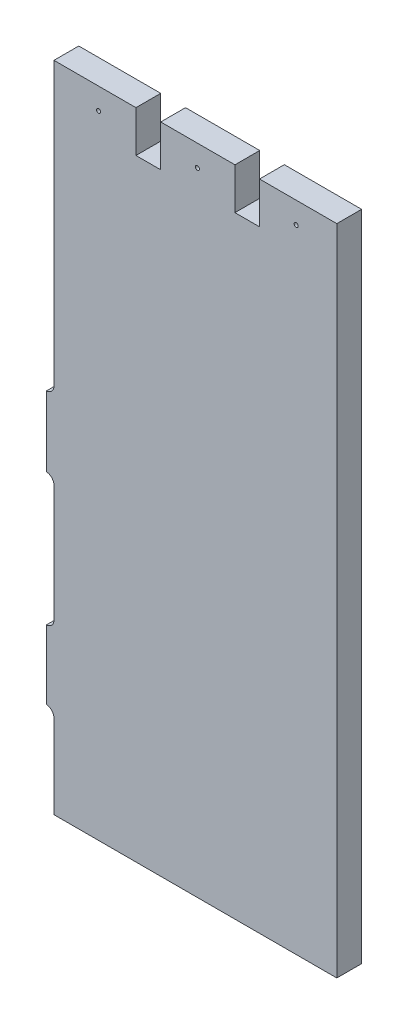
ISO-10303-21;
HEADER;
FILE_DESCRIPTION(('STEP AP214'),'2;1');
FILE_NAME('part.step','',(''),(''),'','','');
FILE_SCHEMA(('AUTOMOTIVE_DESIGN { 1 0 10303 214 1 1 1 1 }'));
ENDSEC;
DATA;
#1=APPLICATION_CONTEXT('core data for automotive mechanical design processes');
#2=APPLICATION_PROTOCOL_DEFINITION('international standard','automotive_design',2000,#1);
#3=PRODUCT_CONTEXT('',#1,'mechanical');
#4=PRODUCT('Part','Part','',(#3));
#5=PRODUCT_RELATED_PRODUCT_CATEGORY('part','',(#4));
#6=PRODUCT_DEFINITION_FORMATION('','',#4);
#7=PRODUCT_DEFINITION_CONTEXT('part definition',#1,'design');
#8=PRODUCT_DEFINITION('design','',#6,#7);
#9=PRODUCT_DEFINITION_SHAPE('','',#8);
#10=(LENGTH_UNIT() NAMED_UNIT(*) SI_UNIT(.MILLI.,.METRE.));
#11=(NAMED_UNIT(*) PLANE_ANGLE_UNIT() SI_UNIT($,.RADIAN.));
#12=(NAMED_UNIT(*) SI_UNIT($,.STERADIAN.) SOLID_ANGLE_UNIT());
#13=UNCERTAINTY_MEASURE_WITH_UNIT(LENGTH_MEASURE(1.E-05),#10,'distance_accuracy_value','');
#14=(GEOMETRIC_REPRESENTATION_CONTEXT(3) GLOBAL_UNCERTAINTY_ASSIGNED_CONTEXT((#13)) GLOBAL_UNIT_ASSIGNED_CONTEXT((#10,
#11,#12)) REPRESENTATION_CONTEXT('',''));
#15=CARTESIAN_POINT('',(0.,0.,0.));
#16=DIRECTION('',(0.,0.,1.));
#17=DIRECTION('',(1.,0.,0.));
#18=AXIS2_PLACEMENT_3D('',#15,#16,#17);
#19=CARTESIAN_POINT('',(12.7445001602175,5.250500201708,1.55632912));
#20=DIRECTION('',(0.,0.,-1.));
#21=DIRECTION('',(-1.,0.,0.));
#22=AXIS2_PLACEMENT_3D('',#19,#20,#21);
#23=CYLINDRICAL_SURFACE('',#22,0.505500087261996);
#24=DIRECTION('',(0.,0.,-1.));
#25=VECTOR('',#24,1.);
#26=CARTESIAN_POINT('',(12.7747376240596,5.75509512241399,1.55632912));
#27=LINE('',#26,#25);
#28=CARTESIAN_POINT('',(12.7747376240596,5.75509512241399,0.));
#29=VERTEX_POINT('',#28);
#30=CARTESIAN_POINT('',(12.7747376240596,5.75509512241399,1.55632912));
#31=VERTEX_POINT('',#30);
#32=EDGE_CURVE('E167',#29,#31,#27,.F.);
#33=ORIENTED_EDGE('',*,*,#32,.F.);
#34=CARTESIAN_POINT('',(12.7445001602175,5.250500201708,0.));
#35=DIRECTION('',(0.,0.,1.));
#36=DIRECTION('',(1.,0.,0.));
#37=AXIS2_PLACEMENT_3D('',#34,#35,#36);
#38=CIRCLE('',#37,0.505500087261996);
#39=CARTESIAN_POINT('',(13.2499999999998,5.25,0.));
#40=VERTEX_POINT('',#39);
#41=EDGE_CURVE('E240',#40,#29,#38,.T.);
#42=ORIENTED_EDGE('',*,*,#41,.F.);
#43=DIRECTION('',(0.,0.,-1.));
#44=VECTOR('',#43,1.);
#45=CARTESIAN_POINT('',(13.2499999999998,5.25,1.55632912));
#46=LINE('',#45,#44);
#47=CARTESIAN_POINT('',(13.2499999999998,5.25,1.55632912));
#48=VERTEX_POINT('',#47);
#49=EDGE_CURVE('E41',#48,#40,#46,.T.);
#50=ORIENTED_EDGE('',*,*,#49,.F.);
#51=CARTESIAN_POINT('',(12.7445001602175,5.250500201708,1.55632912));
#52=DIRECTION('',(0.,0.,1.));
#53=DIRECTION('',(1.,0.,0.));
#54=AXIS2_PLACEMENT_3D('',#51,#52,#53);
#55=CIRCLE('',#54,0.505500087261996);
#56=EDGE_CURVE('E184',#48,#31,#55,.T.);
#57=ORIENTED_EDGE('',*,*,#56,.T.);
#58=EDGE_LOOP('',(#33,#42,#50,#57));
#59=FACE_BOUND('',#58,.T.);
#60=ADVANCED_FACE('F34',(#59),#23,.F.);
#61=CARTESIAN_POINT('',(13.25,0.,1.55632912));
#62=DIRECTION('',(-1.,0.,0.));
#63=DIRECTION('',(0.,-1.,0.));
#64=AXIS2_PLACEMENT_3D('',#61,#62,#63);
#65=PLANE('',#64);
#66=DIRECTION('',(0.,1.,0.));
#67=VECTOR('',#66,1.);
#68=CARTESIAN_POINT('',(13.25,0.,0.));
#69=LINE('',#68,#67);
#70=CARTESIAN_POINT('',(13.25,0.,0.));
#71=VERTEX_POINT('',#70);
#72=EDGE_CURVE('E191',#71,#40,#69,.T.);
#73=ORIENTED_EDGE('',*,*,#72,.F.);
#74=DIRECTION('',(0.,0.,-1.));
#75=VECTOR('',#74,1.);
#76=CARTESIAN_POINT('',(13.25,0.,1.55632912));
#77=LINE('',#76,#75);
#78=CARTESIAN_POINT('',(13.25,0.,1.55632912));
#79=VERTEX_POINT('',#78);
#80=EDGE_CURVE('E281',#79,#71,#77,.T.);
#81=ORIENTED_EDGE('',*,*,#80,.F.);
#82=DIRECTION('',(0.,1.,0.));
#83=VECTOR('',#82,1.);
#84=CARTESIAN_POINT('',(13.25,0.,1.55632912));
#85=LINE('',#84,#83);
#86=EDGE_CURVE('E237',#79,#48,#85,.T.);
#87=ORIENTED_EDGE('',*,*,#86,.T.);
#88=ORIENTED_EDGE('',*,*,#49,.T.);
#89=EDGE_LOOP('',(#73,#81,#87,#88));
#90=FACE_BOUND('',#89,.T.);
#91=ADVANCED_FACE('F374',(#90),#65,.T.);
#92=CARTESIAN_POINT('',(31.,0.,1.55632912));
#93=DIRECTION('',(0.,-1.,0.));
#94=DIRECTION('',(0.,0.,-1.));
#95=AXIS2_PLACEMENT_3D('',#92,#93,#94);
#96=PLANE('',#95);
#97=DIRECTION('',(-1.,0.,0.));
#98=VECTOR('',#97,1.);
#99=CARTESIAN_POINT('',(31.,0.,0.));
#100=LINE('',#99,#98);
#101=CARTESIAN_POINT('',(31.,0.,0.));
#102=VERTEX_POINT('',#101);
#103=EDGE_CURVE('E196',#102,#71,#100,.T.);
#104=ORIENTED_EDGE('',*,*,#103,.F.);
#105=DIRECTION('',(0.,0.,-1.));
#106=VECTOR('',#105,1.);
#107=CARTESIAN_POINT('',(31.,0.,1.55632912));
#108=LINE('',#107,#106);
#109=CARTESIAN_POINT('',(31.,0.,1.55632912));
#110=VERTEX_POINT('',#109);
#111=EDGE_CURVE('E283',#110,#102,#108,.T.);
#112=ORIENTED_EDGE('',*,*,#111,.F.);
#113=DIRECTION('',(-1.,0.,0.));
#114=VECTOR('',#113,1.);
#115=CARTESIAN_POINT('',(31.,0.,1.55632912));
#116=LINE('',#115,#114);
#117=EDGE_CURVE('E234',#110,#79,#116,.T.);
#118=ORIENTED_EDGE('',*,*,#117,.T.);
#119=ORIENTED_EDGE('',*,*,#80,.T.);
#120=EDGE_LOOP('',(#104,#112,#118,#119));
#121=FACE_BOUND('',#120,.T.);
#122=ADVANCED_FACE('F378',(#121),#96,.T.);
#123=CARTESIAN_POINT('',(31.,41.,1.55632912));
#124=DIRECTION('',(1.,0.,0.));
#125=DIRECTION('',(0.,0.,-1.));
#126=AXIS2_PLACEMENT_3D('',#123,#124,#125);
#127=PLANE('',#126);
#128=DIRECTION('',(0.,-1.,0.));
#129=VECTOR('',#128,1.);
#130=CARTESIAN_POINT('',(31.,41.,0.));
#131=LINE('',#130,#129);
#132=CARTESIAN_POINT('',(31.,41.,0.));
#133=VERTEX_POINT('',#132);
#134=EDGE_CURVE('E275',#133,#102,#131,.T.);
#135=ORIENTED_EDGE('',*,*,#134,.F.);
#136=DIRECTION('',(0.,0.,-1.));
#137=VECTOR('',#136,1.);
#138=CARTESIAN_POINT('',(31.,41.,1.55632912));
#139=LINE('',#138,#137);
#140=CARTESIAN_POINT('',(31.,41.,1.55632912));
#141=VERTEX_POINT('',#140);
#142=EDGE_CURVE('E285',#141,#133,#139,.T.);
#143=ORIENTED_EDGE('',*,*,#142,.F.);
#144=DIRECTION('',(0.,-1.,0.));
#145=VECTOR('',#144,1.);
#146=CARTESIAN_POINT('',(31.,41.,1.55632912));
#147=LINE('',#146,#145);
#148=EDGE_CURVE('E231',#141,#110,#147,.T.);
#149=ORIENTED_EDGE('',*,*,#148,.T.);
#150=ORIENTED_EDGE('',*,*,#111,.T.);
#151=EDGE_LOOP('',(#135,#143,#149,#150));
#152=FACE_BOUND('',#151,.T.);
#153=ADVANCED_FACE('F383',(#152),#127,.T.);
#154=CARTESIAN_POINT('',(26.14999961853,41.,1.55632912));
#155=DIRECTION('',(0.,1.,0.));
#156=DIRECTION('',(0.,0.,1.));
#157=AXIS2_PLACEMENT_3D('',#154,#155,#156);
#158=PLANE('',#157);
#159=DIRECTION('',(1.,0.,0.));
#160=VECTOR('',#159,1.);
#161=CARTESIAN_POINT('',(26.14999961853,41.,0.));
#162=LINE('',#161,#160);
#163=CARTESIAN_POINT('',(26.14999961853,41.,0.));
#164=VERTEX_POINT('',#163);
#165=EDGE_CURVE('E272',#164,#133,#162,.T.);
#166=ORIENTED_EDGE('',*,*,#165,.F.);
#167=DIRECTION('',(0.,0.,-1.));
#168=VECTOR('',#167,1.);
#169=CARTESIAN_POINT('',(26.14999961853,41.,1.55632912));
#170=LINE('',#169,#168);
#171=CARTESIAN_POINT('',(26.14999961853,41.,1.55632912));
#172=VERTEX_POINT('',#171);
#173=EDGE_CURVE('E287',#172,#164,#170,.T.);
#174=ORIENTED_EDGE('',*,*,#173,.F.);
#175=DIRECTION('',(1.,0.,0.));
#176=VECTOR('',#175,1.);
#177=CARTESIAN_POINT('',(26.14999961853,41.,1.55632912));
#178=LINE('',#177,#176);
#179=EDGE_CURVE('E228',#172,#141,#178,.T.);
#180=ORIENTED_EDGE('',*,*,#179,.T.);
#181=ORIENTED_EDGE('',*,*,#142,.T.);
#182=EDGE_LOOP('',(#166,#174,#180,#181));
#183=FACE_BOUND('',#182,.T.);
#184=ADVANCED_FACE('F390',(#183),#158,.T.);
#185=CARTESIAN_POINT('',(26.14999961853,38.400001525879,1.55632912));
#186=DIRECTION('',(-1.,0.,0.));
#187=DIRECTION('',(0.,0.,1.));
#188=AXIS2_PLACEMENT_3D('',#185,#186,#187);
#189=PLANE('',#188);
#190=DIRECTION('',(0.,1.,0.));
#191=VECTOR('',#190,1.);
#192=CARTESIAN_POINT('',(26.14999961853,38.400001525879,0.));
#193=LINE('',#192,#191);
#194=CARTESIAN_POINT('',(26.14999961853,38.400001525879,0.));
#195=VERTEX_POINT('',#194);
#196=EDGE_CURVE('E269',#195,#164,#193,.T.);
#197=ORIENTED_EDGE('',*,*,#196,.F.);
#198=DIRECTION('',(0.,0.,-1.));
#199=VECTOR('',#198,1.);
#200=CARTESIAN_POINT('',(26.14999961853,38.400001525879,1.55632912));
#201=LINE('',#200,#199);
#202=CARTESIAN_POINT('',(26.14999961853,38.400001525879,1.55632912));
#203=VERTEX_POINT('',#202);
#204=EDGE_CURVE('E289',#203,#195,#201,.T.);
#205=ORIENTED_EDGE('',*,*,#204,.F.);
#206=DIRECTION('',(0.,1.,0.));
#207=VECTOR('',#206,1.);
#208=CARTESIAN_POINT('',(26.14999961853,38.400001525879,1.55632912));
#209=LINE('',#208,#207);
#210=EDGE_CURVE('E225',#203,#172,#209,.T.);
#211=ORIENTED_EDGE('',*,*,#210,.T.);
#212=ORIENTED_EDGE('',*,*,#173,.T.);
#213=EDGE_LOOP('',(#197,#205,#211,#212));
#214=FACE_BOUND('',#213,.T.);
#215=ADVANCED_FACE('F394',(#214),#189,.T.);
#216=CARTESIAN_POINT('',(24.607000350952,38.400001525879,1.55632912));
#217=DIRECTION('',(0.,1.,0.));
#218=DIRECTION('',(0.,0.,1.));
#219=AXIS2_PLACEMENT_3D('',#216,#217,#218);
#220=PLANE('',#219);
#221=DIRECTION('',(1.,0.,0.));
#222=VECTOR('',#221,1.);
#223=CARTESIAN_POINT('',(24.607000350952,38.400001525879,0.));
#224=LINE('',#223,#222);
#225=CARTESIAN_POINT('',(24.607000350952,38.400001525879,0.));
#226=VERTEX_POINT('',#225);
#227=EDGE_CURVE('E266',#226,#195,#224,.T.);
#228=ORIENTED_EDGE('',*,*,#227,.F.);
#229=DIRECTION('',(0.,0.,-1.));
#230=VECTOR('',#229,1.);
#231=CARTESIAN_POINT('',(24.607000350952,38.400001525879,1.55632912));
#232=LINE('',#231,#230);
#233=CARTESIAN_POINT('',(24.607000350952,38.400001525879,1.55632912));
#234=VERTEX_POINT('',#233);
#235=EDGE_CURVE('E291',#234,#226,#232,.T.);
#236=ORIENTED_EDGE('',*,*,#235,.F.);
#237=DIRECTION('',(1.,0.,0.));
#238=VECTOR('',#237,1.);
#239=CARTESIAN_POINT('',(24.607000350952,38.400001525879,1.55632912));
#240=LINE('',#239,#238);
#241=EDGE_CURVE('E222',#234,#203,#240,.T.);
#242=ORIENTED_EDGE('',*,*,#241,.T.);
#243=ORIENTED_EDGE('',*,*,#204,.T.);
#244=EDGE_LOOP('',(#228,#236,#242,#243));
#245=FACE_BOUND('',#244,.T.);
#246=ADVANCED_FACE('F398',(#245),#220,.T.);
#247=CARTESIAN_POINT('',(24.607000350952,41.,1.55632912));
#248=DIRECTION('',(1.,0.,0.));
#249=DIRECTION('',(0.,0.,-1.));
#250=AXIS2_PLACEMENT_3D('',#247,#248,#249);
#251=PLANE('',#250);
#252=DIRECTION('',(0.,-1.,0.));
#253=VECTOR('',#252,1.);
#254=CARTESIAN_POINT('',(24.607000350952,41.,0.));
#255=LINE('',#254,#253);
#256=CARTESIAN_POINT('',(24.607000350952,41.,0.));
#257=VERTEX_POINT('',#256);
#258=EDGE_CURVE('E263',#257,#226,#255,.T.);
#259=ORIENTED_EDGE('',*,*,#258,.F.);
#260=DIRECTION('',(0.,0.,-1.));
#261=VECTOR('',#260,1.);
#262=CARTESIAN_POINT('',(24.607000350952,41.,1.55632912));
#263=LINE('',#262,#261);
#264=CARTESIAN_POINT('',(24.607000350952,41.,1.55632912));
#265=VERTEX_POINT('',#264);
#266=EDGE_CURVE('E293',#265,#257,#263,.T.);
#267=ORIENTED_EDGE('',*,*,#266,.F.);
#268=DIRECTION('',(0.,-1.,0.));
#269=VECTOR('',#268,1.);
#270=CARTESIAN_POINT('',(24.607000350952,41.,1.55632912));
#271=LINE('',#270,#269);
#272=EDGE_CURVE('E219',#265,#234,#271,.T.);
#273=ORIENTED_EDGE('',*,*,#272,.T.);
#274=ORIENTED_EDGE('',*,*,#235,.T.);
#275=EDGE_LOOP('',(#259,#267,#273,#274));
#276=FACE_BOUND('',#275,.T.);
#277=ADVANCED_FACE('F402',(#276),#251,.T.);
#278=CARTESIAN_POINT('',(19.950000762939,41.,1.55632912));
#279=DIRECTION('',(0.,1.,0.));
#280=DIRECTION('',(0.,0.,1.));
#281=AXIS2_PLACEMENT_3D('',#278,#279,#280);
#282=PLANE('',#281);
#283=DIRECTION('',(1.,0.,0.));
#284=VECTOR('',#283,1.);
#285=CARTESIAN_POINT('',(19.950000762939,41.,0.));
#286=LINE('',#285,#284);
#287=CARTESIAN_POINT('',(19.950000762939,41.,0.));
#288=VERTEX_POINT('',#287);
#289=EDGE_CURVE('E260',#288,#257,#286,.T.);
#290=ORIENTED_EDGE('',*,*,#289,.F.);
#291=DIRECTION('',(0.,0.,-1.));
#292=VECTOR('',#291,1.);
#293=CARTESIAN_POINT('',(19.950000762939,41.,1.55632912));
#294=LINE('',#293,#292);
#295=CARTESIAN_POINT('',(19.950000762939,41.,1.55632912));
#296=VERTEX_POINT('',#295);
#297=EDGE_CURVE('E295',#296,#288,#294,.T.);
#298=ORIENTED_EDGE('',*,*,#297,.F.);
#299=DIRECTION('',(1.,0.,0.));
#300=VECTOR('',#299,1.);
#301=CARTESIAN_POINT('',(19.950000762939,41.,1.55632912));
#302=LINE('',#301,#300);
#303=EDGE_CURVE('E216',#296,#265,#302,.T.);
#304=ORIENTED_EDGE('',*,*,#303,.T.);
#305=ORIENTED_EDGE('',*,*,#266,.T.);
#306=EDGE_LOOP('',(#290,#298,#304,#305));
#307=FACE_BOUND('',#306,.T.);
#308=ADVANCED_FACE('F406',(#307),#282,.T.);
#309=CARTESIAN_POINT('',(19.950000762939,38.400001525879,1.55632912));
#310=DIRECTION('',(-1.,0.,0.));
#311=DIRECTION('',(0.,0.,1.));
#312=AXIS2_PLACEMENT_3D('',#309,#310,#311);
#313=PLANE('',#312);
#314=DIRECTION('',(0.,1.,0.));
#315=VECTOR('',#314,1.);
#316=CARTESIAN_POINT('',(19.950000762939,38.400001525879,0.));
#317=LINE('',#316,#315);
#318=CARTESIAN_POINT('',(19.950000762939,38.400001525879,0.));
#319=VERTEX_POINT('',#318);
#320=EDGE_CURVE('E257',#319,#288,#317,.T.);
#321=ORIENTED_EDGE('',*,*,#320,.F.);
#322=DIRECTION('',(0.,0.,-1.));
#323=VECTOR('',#322,1.);
#324=CARTESIAN_POINT('',(19.950000762939,38.400001525879,1.55632912));
#325=LINE('',#324,#323);
#326=CARTESIAN_POINT('',(19.950000762939,38.400001525879,1.55632912));
#327=VERTEX_POINT('',#326);
#328=EDGE_CURVE('E297',#327,#319,#325,.T.);
#329=ORIENTED_EDGE('',*,*,#328,.F.);
#330=DIRECTION('',(0.,1.,0.));
#331=VECTOR('',#330,1.);
#332=CARTESIAN_POINT('',(19.950000762939,38.400001525879,1.55632912));
#333=LINE('',#332,#331);
#334=EDGE_CURVE('E213',#327,#296,#333,.T.);
#335=ORIENTED_EDGE('',*,*,#334,.T.);
#336=ORIENTED_EDGE('',*,*,#297,.T.);
#337=EDGE_LOOP('',(#321,#329,#335,#336));
#338=FACE_BOUND('',#337,.T.);
#339=ADVANCED_FACE('F410',(#338),#313,.T.);
#340=CARTESIAN_POINT('',(18.393999099731,38.400001525879,1.55632912));
#341=DIRECTION('',(0.,1.,0.));
#342=DIRECTION('',(0.,0.,1.));
#343=AXIS2_PLACEMENT_3D('',#340,#341,#342);
#344=PLANE('',#343);
#345=DIRECTION('',(1.,0.,0.));
#346=VECTOR('',#345,1.);
#347=CARTESIAN_POINT('',(18.393999099731,38.400001525879,0.));
#348=LINE('',#347,#346);
#349=CARTESIAN_POINT('',(18.393999099731,38.400001525879,0.));
#350=VERTEX_POINT('',#349);
#351=EDGE_CURVE('E254',#350,#319,#348,.T.);
#352=ORIENTED_EDGE('',*,*,#351,.F.);
#353=DIRECTION('',(0.,0.,-1.));
#354=VECTOR('',#353,1.);
#355=CARTESIAN_POINT('',(18.393999099731,38.400001525879,1.55632912));
#356=LINE('',#355,#354);
#357=CARTESIAN_POINT('',(18.393999099731,38.400001525879,1.55632912));
#358=VERTEX_POINT('',#357);
#359=EDGE_CURVE('E299',#358,#350,#356,.T.);
#360=ORIENTED_EDGE('',*,*,#359,.F.);
#361=DIRECTION('',(1.,0.,0.));
#362=VECTOR('',#361,1.);
#363=CARTESIAN_POINT('',(18.393999099731,38.400001525879,1.55632912));
#364=LINE('',#363,#362);
#365=EDGE_CURVE('E210',#358,#327,#364,.T.);
#366=ORIENTED_EDGE('',*,*,#365,.T.);
#367=ORIENTED_EDGE('',*,*,#328,.T.);
#368=EDGE_LOOP('',(#352,#360,#366,#367));
#369=FACE_BOUND('',#368,.T.);
#370=ADVANCED_FACE('F414',(#369),#344,.T.);
#371=CARTESIAN_POINT('',(18.393999099731,41.,1.55632912));
#372=DIRECTION('',(1.,0.,0.));
#373=DIRECTION('',(0.,0.,-1.));
#374=AXIS2_PLACEMENT_3D('',#371,#372,#373);
#375=PLANE('',#374);
#376=DIRECTION('',(0.,-1.,0.));
#377=VECTOR('',#376,1.);
#378=CARTESIAN_POINT('',(18.393999099731,41.,0.));
#379=LINE('',#378,#377);
#380=CARTESIAN_POINT('',(18.393999099731,41.,0.));
#381=VERTEX_POINT('',#380);
#382=EDGE_CURVE('E251',#381,#350,#379,.T.);
#383=ORIENTED_EDGE('',*,*,#382,.F.);
#384=DIRECTION('',(0.,0.,-1.));
#385=VECTOR('',#384,1.);
#386=CARTESIAN_POINT('',(18.393999099731,41.,1.55632912));
#387=LINE('',#386,#385);
#388=CARTESIAN_POINT('',(18.393999099731,41.,1.55632912));
#389=VERTEX_POINT('',#388);
#390=EDGE_CURVE('E301',#389,#381,#387,.T.);
#391=ORIENTED_EDGE('',*,*,#390,.F.);
#392=DIRECTION('',(0.,-1.,0.));
#393=VECTOR('',#392,1.);
#394=CARTESIAN_POINT('',(18.393999099731,41.,1.55632912));
#395=LINE('',#394,#393);
#396=EDGE_CURVE('E207',#389,#358,#395,.T.);
#397=ORIENTED_EDGE('',*,*,#396,.T.);
#398=ORIENTED_EDGE('',*,*,#359,.T.);
#399=EDGE_LOOP('',(#383,#391,#397,#398));
#400=FACE_BOUND('',#399,.T.);
#401=ADVANCED_FACE('F418',(#400),#375,.T.);
#402=CARTESIAN_POINT('',(13.25,41.,1.55632912));
#403=DIRECTION('',(0.,1.,0.));
#404=DIRECTION('',(0.,0.,1.));
#405=AXIS2_PLACEMENT_3D('',#402,#403,#404);
#406=PLANE('',#405);
#407=DIRECTION('',(1.,0.,0.));
#408=VECTOR('',#407,1.);
#409=CARTESIAN_POINT('',(13.25,41.,0.));
#410=LINE('',#409,#408);
#411=CARTESIAN_POINT('',(13.25,41.,0.));
#412=VERTEX_POINT('',#411);
#413=EDGE_CURVE('E248',#412,#381,#410,.T.);
#414=ORIENTED_EDGE('',*,*,#413,.F.);
#415=DIRECTION('',(0.,0.,-1.));
#416=VECTOR('',#415,1.);
#417=CARTESIAN_POINT('',(13.25,41.,1.55632912));
#418=LINE('',#417,#416);
#419=CARTESIAN_POINT('',(13.25,41.,1.55632912));
#420=VERTEX_POINT('',#419);
#421=EDGE_CURVE('E303',#420,#412,#418,.T.);
#422=ORIENTED_EDGE('',*,*,#421,.F.);
#423=DIRECTION('',(1.,0.,0.));
#424=VECTOR('',#423,1.);
#425=CARTESIAN_POINT('',(13.25,41.,1.55632912));
#426=LINE('',#425,#424);
#427=EDGE_CURVE('E204',#420,#389,#426,.T.);
#428=ORIENTED_EDGE('',*,*,#427,.T.);
#429=ORIENTED_EDGE('',*,*,#390,.T.);
#430=EDGE_LOOP('',(#414,#422,#428,#429));
#431=FACE_BOUND('',#430,.T.);
#432=ADVANCED_FACE('F422',(#431),#406,.T.);
#433=CARTESIAN_POINT('',(13.2499999999998,23.299999237061,1.55632912));
#434=DIRECTION('',(-1.,0.,0.));
#435=DIRECTION('',(0.,-1.,0.));
#436=AXIS2_PLACEMENT_3D('',#433,#434,#435);
#437=PLANE('',#436);
#438=DIRECTION('',(0.,1.,0.));
#439=VECTOR('',#438,1.);
#440=CARTESIAN_POINT('',(13.2499999999998,23.299999237061,0.));
#441=LINE('',#440,#439);
#442=CARTESIAN_POINT('',(13.2500000000001,23.299999237061,0.));
#443=VERTEX_POINT('',#442);
#444=EDGE_CURVE('E245',#443,#412,#441,.T.);
#445=ORIENTED_EDGE('',*,*,#444,.F.);
#446=DIRECTION('',(0.,0.,-1.));
#447=VECTOR('',#446,1.);
#448=CARTESIAN_POINT('',(13.2500000000001,23.299999237061,1.55632912));
#449=LINE('',#448,#447);
#450=CARTESIAN_POINT('',(13.2500000000001,23.299999237061,1.55632912));
#451=VERTEX_POINT('',#450);
#452=EDGE_CURVE('E239',#451,#443,#449,.T.);
#453=ORIENTED_EDGE('',*,*,#452,.F.);
#454=DIRECTION('',(0.,1.,0.));
#455=VECTOR('',#454,1.);
#456=CARTESIAN_POINT('',(13.2499999999998,23.299999237061,1.55632912));
#457=LINE('',#456,#455);
#458=EDGE_CURVE('E193',#451,#420,#457,.T.);
#459=ORIENTED_EDGE('',*,*,#458,.T.);
#460=ORIENTED_EDGE('',*,*,#421,.T.);
#461=EDGE_LOOP('',(#445,#453,#459,#460));
#462=FACE_BOUND('',#461,.T.);
#463=ADVANCED_FACE('F314',(#462),#437,.T.);
#464=CARTESIAN_POINT('',(12.7445001602175,23.299999237061,1.55632912));
#465=DIRECTION('',(0.,0.,-1.));
#466=DIRECTION('',(-1.,0.,0.));
#467=AXIS2_PLACEMENT_3D('',#464,#465,#466);
#468=CYLINDRICAL_SURFACE('',#467,0.505499839782554);
#469=DIRECTION('',(0.,0.,-1.));
#470=VECTOR('',#469,1.);
#471=CARTESIAN_POINT('',(12.7747376240596,22.7954045642784,1.55632912));
#472=LINE('',#471,#470);
#473=CARTESIAN_POINT('',(12.7747376240596,22.7954045642784,1.55632912));
#474=VERTEX_POINT('',#473);
#475=CARTESIAN_POINT('',(12.7747376240596,22.7954045642784,0.));
#476=VERTEX_POINT('',#475);
#477=EDGE_CURVE('E176',#474,#476,#472,.T.);
#478=ORIENTED_EDGE('',*,*,#477,.F.);
#479=CARTESIAN_POINT('',(12.7445001602175,23.299999237061,1.55632912));
#480=DIRECTION('',(0.,0.,1.));
#481=DIRECTION('',(1.,0.,0.));
#482=AXIS2_PLACEMENT_3D('',#479,#480,#481);
#483=CIRCLE('',#482,0.505499839782554);
#484=EDGE_CURVE('E190',#474,#451,#483,.T.);
#485=ORIENTED_EDGE('',*,*,#484,.T.);
#486=ORIENTED_EDGE('',*,*,#452,.T.);
#487=CARTESIAN_POINT('',(12.7445001602175,23.299999237061,0.));
#488=DIRECTION('',(0.,0.,1.));
#489=DIRECTION('',(1.,0.,0.));
#490=AXIS2_PLACEMENT_3D('',#487,#488,#489);
#491=CIRCLE('',#490,0.505499839782554);
#492=EDGE_CURVE('E242',#476,#443,#491,.T.);
#493=ORIENTED_EDGE('',*,*,#492,.F.);
#494=EDGE_LOOP('',(#478,#485,#486,#493));
#495=FACE_BOUND('',#494,.T.);
#496=ADVANCED_FACE('F310',(#495),#468,.F.);
#497=CARTESIAN_POINT('',(12.7445001602175,5.250500201708,1.55632912));
#498=DIRECTION('',(0.,0.,1.));
#499=DIRECTION('',(1.,0.,0.));
#500=AXIS2_PLACEMENT_3D('',#497,#498,#499);
#501=PLANE('',#500);
#502=DIRECTION('',(0.,1.,0.));
#503=VECTOR('',#502,1.);
#504=CARTESIAN_POINT('',(12.7747376240596,41.,1.55632912));
#505=LINE('',#504,#503);
#506=CARTESIAN_POINT('',(12.7747376240596,10.078576129192,1.55632912));
#507=VERTEX_POINT('',#506);
#508=EDGE_CURVE('E56',#31,#507,#505,.T.);
#509=ORIENTED_EDGE('',*,*,#508,.F.);
#510=ORIENTED_EDGE('',*,*,#56,.F.);
#511=ORIENTED_EDGE('',*,*,#86,.F.);
#512=ORIENTED_EDGE('',*,*,#117,.F.);
#513=ORIENTED_EDGE('',*,*,#148,.F.);
#514=ORIENTED_EDGE('',*,*,#179,.F.);
#515=ORIENTED_EDGE('',*,*,#210,.F.);
#516=ORIENTED_EDGE('',*,*,#241,.F.);
#517=ORIENTED_EDGE('',*,*,#272,.F.);
#518=ORIENTED_EDGE('',*,*,#303,.F.);
#519=ORIENTED_EDGE('',*,*,#334,.F.);
#520=ORIENTED_EDGE('',*,*,#365,.F.);
#521=ORIENTED_EDGE('',*,*,#396,.F.);
#522=ORIENTED_EDGE('',*,*,#427,.F.);
#523=ORIENTED_EDGE('',*,*,#458,.F.);
#524=ORIENTED_EDGE('',*,*,#484,.F.);
#525=CARTESIAN_POINT('',(12.7747376240596,18.399387291325,1.55632912));
#526=VERTEX_POINT('',#525);
#527=EDGE_CURVE('E188',#526,#474,#505,.T.);
#528=ORIENTED_EDGE('',*,*,#527,.F.);
#529=CARTESIAN_POINT('',(12.7500000023335,17.8999996185317,1.55632912));
#530=DIRECTION('',(0.,0.,-1.));
#531=DIRECTION('',(1.,0.,0.));
#532=AXIS2_PLACEMENT_3D('',#529,#530,#531);
#533=CIRCLE('',#532,0.499999997666533);
#534=CARTESIAN_POINT('',(13.25,17.8999996185317,1.55632912));
#535=VERTEX_POINT('',#534);
#536=EDGE_CURVE('E326',#526,#535,#533,.T.);
#537=ORIENTED_EDGE('',*,*,#536,.T.);
#538=DIRECTION('',(0.,-1.,0.));
#539=VECTOR('',#538,1.);
#540=CARTESIAN_POINT('',(13.25,10.600000381472,1.55632912));
#541=LINE('',#540,#539);
#542=CARTESIAN_POINT('',(13.25,10.600000381472,1.55632912));
#543=VERTEX_POINT('',#542);
#544=EDGE_CURVE('E328',#535,#543,#541,.T.);
#545=ORIENTED_EDGE('',*,*,#544,.T.);
#546=CARTESIAN_POINT('',(12.750748009729,10.577747674036,1.55632912));
#547=DIRECTION('',(0.,0.,-1.));
#548=DIRECTION('',(1.,0.,0.));
#549=AXIS2_PLACEMENT_3D('',#546,#547,#548);
#550=CIRCLE('',#549,0.499747669106782);
#551=EDGE_CURVE('E187',#543,#507,#550,.T.);
#552=ORIENTED_EDGE('',*,*,#551,.T.);
#553=EDGE_LOOP('',(#509,#510,#511,#512,#513,#514,#515,#516,#517,#518,#519,#520,#521,#522,#523,
#524,#528,#537,#545,#552));
#554=FACE_BOUND('',#553,.T.);
#555=CARTESIAN_POINT('',(16.04999838,39.64999944,1.55632912));
#556=DIRECTION('',(0.,0.,-1.));
#557=DIRECTION('',(1.,0.,0.));
#558=AXIS2_PLACEMENT_3D('',#555,#556,#557);
#559=CIRCLE('',#558,0.126999999999999);
#560=CARTESIAN_POINT('',(16.17699838,39.64999944,1.55632912));
#561=VERTEX_POINT('',#560);
#562=EDGE_CURVE('E344',#561,#561,#559,.T.);
#563=ORIENTED_EDGE('',*,*,#562,.T.);
#564=EDGE_LOOP('',(#563));
#565=FACE_BOUND('',#564,.T.);
#566=CARTESIAN_POINT('',(28.44999898,39.64999944,1.55632912));
#567=DIRECTION('',(0.,0.,-1.));
#568=DIRECTION('',(1.,0.,0.));
#569=AXIS2_PLACEMENT_3D('',#566,#567,#568);
#570=CIRCLE('',#569,0.126999999999999);
#571=CARTESIAN_POINT('',(28.57699898,39.64999944,1.55632912));
#572=VERTEX_POINT('',#571);
#573=EDGE_CURVE('E350',#572,#572,#570,.T.);
#574=ORIENTED_EDGE('',*,*,#573,.T.);
#575=EDGE_LOOP('',(#574));
#576=FACE_BOUND('',#575,.T.);
#577=CARTESIAN_POINT('',(22.24999868,39.64999944,1.55632912));
#578=DIRECTION('',(0.,0.,-1.));
#579=DIRECTION('',(1.,0.,0.));
#580=AXIS2_PLACEMENT_3D('',#577,#578,#579);
#581=CIRCLE('',#580,0.126999999999999);
#582=CARTESIAN_POINT('',(22.37699868,39.64999944,1.55632912));
#583=VERTEX_POINT('',#582);
#584=EDGE_CURVE('E243',#583,#583,#581,.T.);
#585=ORIENTED_EDGE('',*,*,#584,.T.);
#586=EDGE_LOOP('',(#585));
#587=FACE_BOUND('',#586,.T.);
#588=ADVANCED_FACE('F181',(#554,#565,#576,#587),#501,.T.);
#589=CARTESIAN_POINT('',(12.7445001602175,5.250500201708,0.));
#590=DIRECTION('',(0.,0.,1.));
#591=DIRECTION('',(1.,0.,0.));
#592=AXIS2_PLACEMENT_3D('',#589,#590,#591);
#593=PLANE('',#592);
#594=ORIENTED_EDGE('',*,*,#41,.T.);
#595=DIRECTION('',(0.,1.,0.));
#596=VECTOR('',#595,1.);
#597=CARTESIAN_POINT('',(12.7747376240596,41.,0.));
#598=LINE('',#597,#596);
#599=CARTESIAN_POINT('',(12.7747376240596,10.078576129192,0.));
#600=VERTEX_POINT('',#599);
#601=EDGE_CURVE('E170',#29,#600,#598,.T.);
#602=ORIENTED_EDGE('',*,*,#601,.T.);
#603=CARTESIAN_POINT('',(12.750748009729,10.577747674036,0.));
#604=DIRECTION('',(0.,0.,-1.));
#605=DIRECTION('',(1.,0.,0.));
#606=AXIS2_PLACEMENT_3D('',#603,#604,#605);
#607=CIRCLE('',#606,0.499747669106782);
#608=CARTESIAN_POINT('',(13.25,10.600000381472,0.));
#609=VERTEX_POINT('',#608);
#610=EDGE_CURVE('E329',#609,#600,#607,.T.);
#611=ORIENTED_EDGE('',*,*,#610,.F.);
#612=DIRECTION('',(0.,-1.,0.));
#613=VECTOR('',#612,1.);
#614=CARTESIAN_POINT('',(13.25,10.600000381472,0.));
#615=LINE('',#614,#613);
#616=CARTESIAN_POINT('',(13.25,17.8999996185317,0.));
#617=VERTEX_POINT('',#616);
#618=EDGE_CURVE('E334',#617,#609,#615,.T.);
#619=ORIENTED_EDGE('',*,*,#618,.F.);
#620=CARTESIAN_POINT('',(12.7500000023335,17.8999996185317,0.));
#621=DIRECTION('',(0.,0.,-1.));
#622=DIRECTION('',(1.,0.,0.));
#623=AXIS2_PLACEMENT_3D('',#620,#621,#622);
#624=CIRCLE('',#623,0.499999997666533);
#625=CARTESIAN_POINT('',(12.7747376240596,18.399387291325,0.));
#626=VERTEX_POINT('',#625);
#627=EDGE_CURVE('E175',#626,#617,#624,.T.);
#628=ORIENTED_EDGE('',*,*,#627,.F.);
#629=EDGE_CURVE('E48',#626,#476,#598,.T.);
#630=ORIENTED_EDGE('',*,*,#629,.T.);
#631=ORIENTED_EDGE('',*,*,#492,.T.);
#632=ORIENTED_EDGE('',*,*,#444,.T.);
#633=ORIENTED_EDGE('',*,*,#413,.T.);
#634=ORIENTED_EDGE('',*,*,#382,.T.);
#635=ORIENTED_EDGE('',*,*,#351,.T.);
#636=ORIENTED_EDGE('',*,*,#320,.T.);
#637=ORIENTED_EDGE('',*,*,#289,.T.);
#638=ORIENTED_EDGE('',*,*,#258,.T.);
#639=ORIENTED_EDGE('',*,*,#227,.T.);
#640=ORIENTED_EDGE('',*,*,#196,.T.);
#641=ORIENTED_EDGE('',*,*,#165,.T.);
#642=ORIENTED_EDGE('',*,*,#134,.T.);
#643=ORIENTED_EDGE('',*,*,#103,.T.);
#644=ORIENTED_EDGE('',*,*,#72,.T.);
#645=EDGE_LOOP('',(#594,#602,#611,#619,#628,#630,#631,#632,#633,#634,#635,#636,#637,#638,#639,
#640,#641,#642,#643,#644));
#646=FACE_BOUND('',#645,.T.);
#647=CARTESIAN_POINT('',(16.04999838,39.64999944,0.));
#648=DIRECTION('',(0.,0.,-1.));
#649=DIRECTION('',(1.,0.,0.));
#650=AXIS2_PLACEMENT_3D('',#647,#648,#649);
#651=CIRCLE('',#650,0.126999999999999);
#652=CARTESIAN_POINT('',(16.17699838,39.64999944,0.));
#653=VERTEX_POINT('',#652);
#654=EDGE_CURVE('E341',#653,#653,#651,.T.);
#655=ORIENTED_EDGE('',*,*,#654,.F.);
#656=EDGE_LOOP('',(#655));
#657=FACE_BOUND('',#656,.T.);
#658=CARTESIAN_POINT('',(28.44999898,39.64999944,0.));
#659=DIRECTION('',(0.,0.,-1.));
#660=DIRECTION('',(1.,0.,0.));
#661=AXIS2_PLACEMENT_3D('',#658,#659,#660);
#662=CIRCLE('',#661,0.126999999999999);
#663=CARTESIAN_POINT('',(28.57699898,39.64999944,0.));
#664=VERTEX_POINT('',#663);
#665=EDGE_CURVE('E347',#664,#664,#662,.T.);
#666=ORIENTED_EDGE('',*,*,#665,.F.);
#667=EDGE_LOOP('',(#666));
#668=FACE_BOUND('',#667,.T.);
#669=CARTESIAN_POINT('',(22.24999868,39.64999944,0.));
#670=DIRECTION('',(0.,0.,-1.));
#671=DIRECTION('',(1.,0.,0.));
#672=AXIS2_PLACEMENT_3D('',#669,#670,#671);
#673=CIRCLE('',#672,0.126999999999999);
#674=CARTESIAN_POINT('',(22.37699868,39.64999944,0.));
#675=VERTEX_POINT('',#674);
#676=EDGE_CURVE('E199',#675,#675,#673,.T.);
#677=ORIENTED_EDGE('',*,*,#676,.F.);
#678=EDGE_LOOP('',(#677));
#679=FACE_BOUND('',#678,.T.);
#680=ADVANCED_FACE('F317',(#646,#657,#668,#679),#593,.F.);
#681=CARTESIAN_POINT('',(22.24999868,39.64999944,1.55632912));
#682=DIRECTION('',(0.,0.,-1.));
#683=DIRECTION('',(-1.,0.,0.));
#684=AXIS2_PLACEMENT_3D('',#681,#682,#683);
#685=CYLINDRICAL_SURFACE('',#684,0.126999999999999);
#686=ORIENTED_EDGE('',*,*,#584,.F.);
#687=EDGE_LOOP('',(#686));
#688=FACE_BOUND('',#687,.T.);
#689=ORIENTED_EDGE('',*,*,#676,.T.);
#690=EDGE_LOOP('',(#689));
#691=FACE_BOUND('',#690,.T.);
#692=ADVANCED_FACE('F360',(#688,#691),#685,.F.);
#693=CARTESIAN_POINT('',(28.44999898,39.64999944,1.55632912));
#694=DIRECTION('',(0.,0.,-1.));
#695=DIRECTION('',(-1.,0.,0.));
#696=AXIS2_PLACEMENT_3D('',#693,#694,#695);
#697=CYLINDRICAL_SURFACE('',#696,0.126999999999999);
#698=ORIENTED_EDGE('',*,*,#573,.F.);
#699=EDGE_LOOP('',(#698));
#700=FACE_BOUND('',#699,.T.);
#701=ORIENTED_EDGE('',*,*,#665,.T.);
#702=EDGE_LOOP('',(#701));
#703=FACE_BOUND('',#702,.T.);
#704=ADVANCED_FACE('F368',(#700,#703),#697,.F.);
#705=CARTESIAN_POINT('',(16.04999838,39.64999944,1.55632912));
#706=DIRECTION('',(0.,0.,-1.));
#707=DIRECTION('',(-1.,0.,0.));
#708=AXIS2_PLACEMENT_3D('',#705,#706,#707);
#709=CYLINDRICAL_SURFACE('',#708,0.126999999999999);
#710=ORIENTED_EDGE('',*,*,#562,.F.);
#711=EDGE_LOOP('',(#710));
#712=FACE_BOUND('',#711,.T.);
#713=ORIENTED_EDGE('',*,*,#654,.T.);
#714=EDGE_LOOP('',(#713));
#715=FACE_BOUND('',#714,.T.);
#716=ADVANCED_FACE('F455',(#712,#715),#709,.F.);
#717=CARTESIAN_POINT('',(12.7500000023335,17.8999996185317,1.55632912));
#718=DIRECTION('',(0.,0.,-1.));
#719=DIRECTION('',(-1.,0.,0.));
#720=AXIS2_PLACEMENT_3D('',#717,#718,#719);
#721=CYLINDRICAL_SURFACE('',#720,0.499999997666533);
#722=ORIENTED_EDGE('',*,*,#536,.F.);
#723=DIRECTION('',(0.,0.,-1.));
#724=VECTOR('',#723,1.);
#725=CARTESIAN_POINT('',(12.7747376240596,18.399387291325,1.55632912));
#726=LINE('',#725,#724);
#727=EDGE_CURVE('E322',#526,#626,#726,.T.);
#728=ORIENTED_EDGE('',*,*,#727,.T.);
#729=ORIENTED_EDGE('',*,*,#627,.T.);
#730=DIRECTION('',(0.,0.,-1.));
#731=VECTOR('',#730,1.);
#732=CARTESIAN_POINT('',(13.25,17.8999996185317,1.55632912));
#733=LINE('',#732,#731);
#734=EDGE_CURVE('E332',#535,#617,#733,.T.);
#735=ORIENTED_EDGE('',*,*,#734,.F.);
#736=EDGE_LOOP('',(#722,#728,#729,#735));
#737=FACE_BOUND('',#736,.T.);
#738=ADVANCED_FACE('F449',(#737),#721,.F.);
#739=CARTESIAN_POINT('',(12.750748009729,10.577747674036,1.55632912));
#740=DIRECTION('',(0.,0.,-1.));
#741=DIRECTION('',(-1.,0.,0.));
#742=AXIS2_PLACEMENT_3D('',#739,#740,#741);
#743=CYLINDRICAL_SURFACE('',#742,0.499747669106782);
#744=ORIENTED_EDGE('',*,*,#610,.T.);
#745=DIRECTION('',(0.,0.,-1.));
#746=VECTOR('',#745,1.);
#747=CARTESIAN_POINT('',(12.7747376240596,10.078576129192,1.55632912));
#748=LINE('',#747,#746);
#749=EDGE_CURVE('E11',#600,#507,#748,.F.);
#750=ORIENTED_EDGE('',*,*,#749,.T.);
#751=ORIENTED_EDGE('',*,*,#551,.F.);
#752=DIRECTION('',(0.,0.,-1.));
#753=VECTOR('',#752,1.);
#754=CARTESIAN_POINT('',(13.25,10.600000381472,1.55632912));
#755=LINE('',#754,#753);
#756=EDGE_CURVE('E339',#543,#609,#755,.T.);
#757=ORIENTED_EDGE('',*,*,#756,.T.);
#758=EDGE_LOOP('',(#744,#750,#751,#757));
#759=FACE_BOUND('',#758,.T.);
#760=ADVANCED_FACE('F454',(#759),#743,.F.);
#761=CARTESIAN_POINT('',(13.25,10.600000381472,1.55632912));
#762=DIRECTION('',(1.,0.,0.));
#763=DIRECTION('',(0.,1.,0.));
#764=AXIS2_PLACEMENT_3D('',#761,#762,#763);
#765=PLANE('',#764);
#766=ORIENTED_EDGE('',*,*,#618,.T.);
#767=ORIENTED_EDGE('',*,*,#756,.F.);
#768=ORIENTED_EDGE('',*,*,#544,.F.);
#769=ORIENTED_EDGE('',*,*,#734,.T.);
#770=EDGE_LOOP('',(#766,#767,#768,#769));
#771=FACE_BOUND('',#770,.T.);
#772=ADVANCED_FACE('F467',(#771),#765,.F.);
#773=CARTESIAN_POINT('',(12.7747376240596,41.,0.));
#774=DIRECTION('',(1.,0.,0.));
#775=DIRECTION('',(0.,0.,-1.));
#776=AXIS2_PLACEMENT_3D('',#773,#774,#775);
#777=PLANE('',#776);
#778=ORIENTED_EDGE('',*,*,#32,.T.);
#779=ORIENTED_EDGE('',*,*,#508,.T.);
#780=ORIENTED_EDGE('',*,*,#749,.F.);
#781=ORIENTED_EDGE('',*,*,#601,.F.);
#782=EDGE_LOOP('',(#778,#779,#780,#781));
#783=FACE_BOUND('',#782,.T.);
#784=ADVANCED_FACE('F168',(#783),#777,.F.);
#785=ORIENTED_EDGE('',*,*,#477,.T.);
#786=ORIENTED_EDGE('',*,*,#629,.F.);
#787=ORIENTED_EDGE('',*,*,#727,.F.);
#788=ORIENTED_EDGE('',*,*,#527,.T.);
#789=EDGE_LOOP('',(#785,#786,#787,#788));
#790=FACE_BOUND('',#789,.T.);
#791=ADVANCED_FACE('F479',(#790),#777,.F.);
#792=CLOSED_SHELL('',(#60,#91,#122,#153,#184,#215,#246,#277,#308,#339,#370,#401,#432,#463,#496,
#588,#680,#692,#704,#716,#738,#760,#772,#784,#791));
#793=MANIFOLD_SOLID_BREP('B2',#792);
#794=ADVANCED_BREP_SHAPE_REPRESENTATION('',(#18,#793),#14);
#795=SHAPE_DEFINITION_REPRESENTATION(#9,#794);
ENDSEC;
END-ISO-10303-21;
